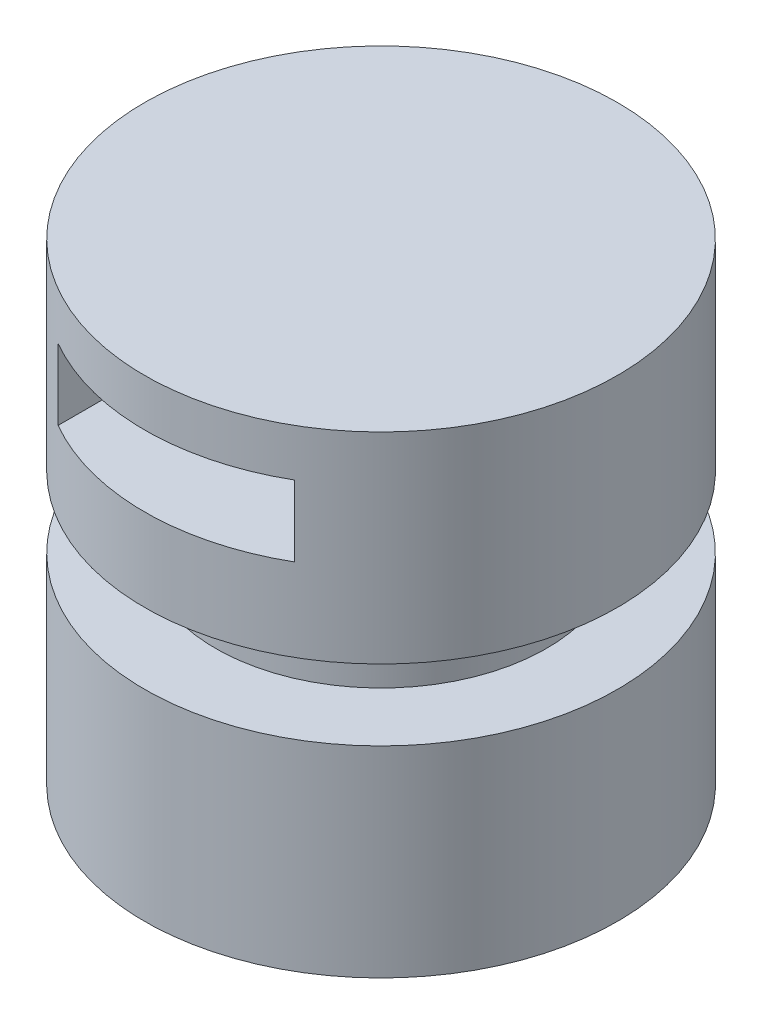
ISO-10303-21;
HEADER;
FILE_DESCRIPTION(('STEP AP214'),'2;1');
FILE_NAME('part.step','',(''),(''),'','','');
FILE_SCHEMA(('AUTOMOTIVE_DESIGN { 1 0 10303 214 1 1 1 1 }'));
ENDSEC;
DATA;
#1=APPLICATION_CONTEXT('core data for automotive mechanical design processes');
#2=APPLICATION_PROTOCOL_DEFINITION('international standard','automotive_design',2000,#1);
#3=PRODUCT_CONTEXT('',#1,'mechanical');
#4=PRODUCT('Part','Part','',(#3));
#5=PRODUCT_RELATED_PRODUCT_CATEGORY('part','',(#4));
#6=PRODUCT_DEFINITION_FORMATION('','',#4);
#7=PRODUCT_DEFINITION_CONTEXT('part definition',#1,'design');
#8=PRODUCT_DEFINITION('design','',#6,#7);
#9=PRODUCT_DEFINITION_SHAPE('','',#8);
#10=(LENGTH_UNIT() NAMED_UNIT(*) SI_UNIT(.MILLI.,.METRE.));
#11=(NAMED_UNIT(*) PLANE_ANGLE_UNIT() SI_UNIT($,.RADIAN.));
#12=(NAMED_UNIT(*) SI_UNIT($,.STERADIAN.) SOLID_ANGLE_UNIT());
#13=UNCERTAINTY_MEASURE_WITH_UNIT(LENGTH_MEASURE(1.E-05),#10,'distance_accuracy_value','');
#14=(GEOMETRIC_REPRESENTATION_CONTEXT(3) GLOBAL_UNCERTAINTY_ASSIGNED_CONTEXT((#13)) GLOBAL_UNIT_ASSIGNED_CONTEXT((#10,
#11,#12)) REPRESENTATION_CONTEXT('',''));
#15=CARTESIAN_POINT('',(0.,0.,0.));
#16=DIRECTION('',(0.,0.,1.));
#17=DIRECTION('',(1.,0.,0.));
#18=AXIS2_PLACEMENT_3D('',#15,#16,#17);
#19=CARTESIAN_POINT('',(0.,0.,0.));
#20=DIRECTION('',(0.,-1.,0.));
#21=DIRECTION('',(0.,0.,-1.));
#22=AXIS2_PLACEMENT_3D('',#19,#20,#21);
#23=CYLINDRICAL_SURFACE('',#22,100.);
#24=CARTESIAN_POINT('',(0.,85.,0.));
#25=DIRECTION('',(0.,-1.,0.));
#26=DIRECTION('',(0.,0.,-1.));
#27=AXIS2_PLACEMENT_3D('',#24,#25,#26);
#28=CIRCLE('',#27,100.);
#29=CARTESIAN_POINT('',(0.,85.,-100.));
#30=VERTEX_POINT('',#29);
#31=EDGE_CURVE('E110',#30,#30,#28,.T.);
#32=ORIENTED_EDGE('',*,*,#31,.T.);
#33=EDGE_LOOP('',(#32));
#34=FACE_BOUND('',#33,.T.);
#35=CARTESIAN_POINT('',(0.,0.,0.));
#36=DIRECTION('',(0.,-1.,0.));
#37=DIRECTION('',(0.,0.,-1.));
#38=AXIS2_PLACEMENT_3D('',#35,#36,#37);
#39=CIRCLE('',#38,100.);
#40=CARTESIAN_POINT('',(0.,0.,-100.));
#41=VERTEX_POINT('',#40);
#42=EDGE_CURVE('E113',#41,#41,#39,.T.);
#43=ORIENTED_EDGE('',*,*,#42,.F.);
#44=EDGE_LOOP('',(#43));
#45=FACE_BOUND('',#44,.T.);
#46=ADVANCED_FACE('F33',(#34,#45),#23,.T.);
#47=CARTESIAN_POINT('',(0.,0.,0.));
#48=DIRECTION('',(0.,-1.,0.));
#49=DIRECTION('',(0.,0.,-1.));
#50=AXIS2_PLACEMENT_3D('',#47,#48,#49);
#51=PLANE('',#50);
#52=ORIENTED_EDGE('',*,*,#42,.T.);
#53=EDGE_LOOP('',(#52));
#54=FACE_BOUND('',#53,.T.);
#55=ADVANCED_FACE('F136',(#54),#51,.T.);
#56=CARTESIAN_POINT('',(0.,85.,-100.));
#57=DIRECTION('',(0.,-1.,0.));
#58=DIRECTION('',(0.,0.,-1.));
#59=AXIS2_PLACEMENT_3D('',#56,#57,#58);
#60=PLANE('',#59);
#61=ORIENTED_EDGE('',*,*,#31,.F.);
#62=EDGE_LOOP('',(#61));
#63=FACE_BOUND('',#62,.T.);
#64=CARTESIAN_POINT('',(0.,85.,0.));
#65=DIRECTION('',(0.,-1.,0.));
#66=DIRECTION('',(0.,0.,-1.));
#67=AXIS2_PLACEMENT_3D('',#64,#65,#66);
#68=CIRCLE('',#67,70.);
#69=CARTESIAN_POINT('',(0.,85.,-70.));
#70=VERTEX_POINT('',#69);
#71=EDGE_CURVE('E107',#70,#70,#68,.T.);
#72=ORIENTED_EDGE('',*,*,#71,.T.);
#73=EDGE_LOOP('',(#72));
#74=FACE_BOUND('',#73,.T.);
#75=ADVANCED_FACE('F141',(#63,#74),#60,.F.);
#76=CARTESIAN_POINT('',(0.,-52.4217949634289,0.));
#77=DIRECTION('',(0.,-1.,0.));
#78=DIRECTION('',(0.,0.,-1.));
#79=AXIS2_PLACEMENT_3D('',#76,#77,#78);
#80=CYLINDRICAL_SURFACE('',#79,70.);
#81=ORIENTED_EDGE('',*,*,#71,.F.);
#82=EDGE_LOOP('',(#81));
#83=FACE_BOUND('',#82,.T.);
#84=CARTESIAN_POINT('',(0.,115.,0.));
#85=DIRECTION('',(0.,-1.,0.));
#86=DIRECTION('',(0.,0.,-1.));
#87=AXIS2_PLACEMENT_3D('',#84,#85,#86);
#88=CIRCLE('',#87,70.);
#89=CARTESIAN_POINT('',(0.,115.,-70.));
#90=VERTEX_POINT('',#89);
#91=EDGE_CURVE('E104',#90,#90,#88,.T.);
#92=ORIENTED_EDGE('',*,*,#91,.T.);
#93=EDGE_LOOP('',(#92));
#94=FACE_BOUND('',#93,.T.);
#95=ADVANCED_FACE('F149',(#83,#94),#80,.T.);
#96=CARTESIAN_POINT('',(0.,115.,-100.));
#97=DIRECTION('',(0.,1.,0.));
#98=DIRECTION('',(0.,0.,1.));
#99=AXIS2_PLACEMENT_3D('',#96,#97,#98);
#100=PLANE('',#99);
#101=ORIENTED_EDGE('',*,*,#91,.F.);
#102=EDGE_LOOP('',(#101));
#103=FACE_BOUND('',#102,.T.);
#104=CARTESIAN_POINT('',(0.,115.,0.));
#105=DIRECTION('',(0.,-1.,0.));
#106=DIRECTION('',(0.,0.,-1.));
#107=AXIS2_PLACEMENT_3D('',#104,#105,#106);
#108=CIRCLE('',#107,100.);
#109=CARTESIAN_POINT('',(0.,115.,-100.));
#110=VERTEX_POINT('',#109);
#111=EDGE_CURVE('E101',#110,#110,#108,.T.);
#112=ORIENTED_EDGE('',*,*,#111,.T.);
#113=EDGE_LOOP('',(#112));
#114=FACE_BOUND('',#113,.T.);
#115=ADVANCED_FACE('F132',(#103,#114),#100,.F.);
#116=CARTESIAN_POINT('',(0.,200.,0.));
#117=DIRECTION('',(0.,1.,0.));
#118=DIRECTION('',(0.,0.,1.));
#119=AXIS2_PLACEMENT_3D('',#116,#117,#118);
#120=PLANE('',#119);
#121=CARTESIAN_POINT('',(0.,200.,0.));
#122=DIRECTION('',(0.,-1.,0.));
#123=DIRECTION('',(0.,0.,-1.));
#124=AXIS2_PLACEMENT_3D('',#121,#122,#123);
#125=CIRCLE('',#124,100.);
#126=CARTESIAN_POINT('',(0.,200.,-100.));
#127=VERTEX_POINT('',#126);
#128=EDGE_CURVE('E116',#127,#127,#125,.T.);
#129=ORIENTED_EDGE('',*,*,#128,.F.);
#130=EDGE_LOOP('',(#129));
#131=FACE_BOUND('',#130,.T.);
#132=ADVANCED_FACE('F35',(#131),#120,.T.);
#133=CARTESIAN_POINT('',(0.,150.,0.));
#134=DIRECTION('',(0.,-1.,0.));
#135=DIRECTION('',(0.,0.,-1.));
#136=AXIS2_PLACEMENT_3D('',#133,#134,#135);
#137=CIRCLE('',#136,100.);
#138=CARTESIAN_POINT('',(-50.,150.,86.6025403784438));
#139=VERTEX_POINT('',#138);
#140=CARTESIAN_POINT('',(50.,150.,86.6025403784438));
#141=VERTEX_POINT('',#140);
#142=EDGE_CURVE('E56',#139,#141,#137,.F.);
#143=ORIENTED_EDGE('',*,*,#142,.F.);
#144=DIRECTION('',(0.,-1.,0.));
#145=VECTOR('',#144,1.);
#146=CARTESIAN_POINT('',(-50.,0.,86.6025403784438));
#147=LINE('',#146,#145);
#148=CARTESIAN_POINT('',(-50.,180.,86.6025403784438));
#149=VERTEX_POINT('',#148);
#150=EDGE_CURVE('E11',#149,#139,#147,.T.);
#151=ORIENTED_EDGE('',*,*,#150,.F.);
#152=CARTESIAN_POINT('',(0.,180.,0.));
#153=DIRECTION('',(0.,1.,0.));
#154=DIRECTION('',(0.,0.,1.));
#155=AXIS2_PLACEMENT_3D('',#152,#153,#154);
#156=CIRCLE('',#155,100.);
#157=CARTESIAN_POINT('',(50.,180.,86.6025403784438));
#158=VERTEX_POINT('',#157);
#159=EDGE_CURVE('E85',#158,#149,#156,.F.);
#160=ORIENTED_EDGE('',*,*,#159,.F.);
#161=DIRECTION('',(0.,-1.,0.));
#162=VECTOR('',#161,1.);
#163=CARTESIAN_POINT('',(50.,0.,86.6025403784438));
#164=LINE('',#163,#162);
#165=EDGE_CURVE('E83',#141,#158,#164,.F.);
#166=ORIENTED_EDGE('',*,*,#165,.F.);
#167=EDGE_LOOP('',(#143,#151,#160,#166));
#168=FACE_BOUND('',#167,.T.);
#169=DIRECTION('',(0.,-1.,0.));
#170=VECTOR('',#169,1.);
#171=CARTESIAN_POINT('',(-50.,0.,-86.6025403784438));
#172=LINE('',#171,#170);
#173=CARTESIAN_POINT('',(-50.,150.,-86.6025403784438));
#174=VERTEX_POINT('',#173);
#175=CARTESIAN_POINT('',(-50.,180.,-86.6025403784438));
#176=VERTEX_POINT('',#175);
#177=EDGE_CURVE('E41',#174,#176,#172,.F.);
#178=ORIENTED_EDGE('',*,*,#177,.F.);
#179=CARTESIAN_POINT('',(50.,150.,-86.6025403784438));
#180=VERTEX_POINT('',#179);
#181=EDGE_CURVE('E82',#180,#174,#137,.F.);
#182=ORIENTED_EDGE('',*,*,#181,.F.);
#183=DIRECTION('',(0.,-1.,0.));
#184=VECTOR('',#183,1.);
#185=CARTESIAN_POINT('',(50.,0.,-86.6025403784438));
#186=LINE('',#185,#184);
#187=CARTESIAN_POINT('',(50.,180.,-86.6025403784438));
#188=VERTEX_POINT('',#187);
#189=EDGE_CURVE('E80',#188,#180,#186,.T.);
#190=ORIENTED_EDGE('',*,*,#189,.F.);
#191=EDGE_CURVE('E75',#176,#188,#156,.F.);
#192=ORIENTED_EDGE('',*,*,#191,.F.);
#193=EDGE_LOOP('',(#178,#182,#190,#192));
#194=FACE_BOUND('',#193,.T.);
#195=ORIENTED_EDGE('',*,*,#111,.F.);
#196=EDGE_LOOP('',(#195));
#197=FACE_BOUND('',#196,.T.);
#198=ORIENTED_EDGE('',*,*,#128,.T.);
#199=EDGE_LOOP('',(#198));
#200=FACE_BOUND('',#199,.T.);
#201=ADVANCED_FACE('F77',(#168,#194,#197,#200),#23,.T.);
#202=CARTESIAN_POINT('',(50.,150.,-100.));
#203=DIRECTION('',(1.,0.,0.));
#204=DIRECTION('',(0.,0.,-1.));
#205=AXIS2_PLACEMENT_3D('',#202,#203,#204);
#206=PLANE('',#205);
#207=ORIENTED_EDGE('',*,*,#165,.T.);
#208=DIRECTION('',(0.,0.,1.));
#209=VECTOR('',#208,1.);
#210=CARTESIAN_POINT('',(50.,180.,-100.));
#211=LINE('',#210,#209);
#212=EDGE_CURVE('E48',#188,#158,#211,.T.);
#213=ORIENTED_EDGE('',*,*,#212,.F.);
#214=ORIENTED_EDGE('',*,*,#189,.T.);
#215=DIRECTION('',(0.,0.,1.));
#216=VECTOR('',#215,1.);
#217=CARTESIAN_POINT('',(50.,150.,-100.));
#218=LINE('',#217,#216);
#219=EDGE_CURVE('E96',#180,#141,#218,.T.);
#220=ORIENTED_EDGE('',*,*,#219,.T.);
#221=EDGE_LOOP('',(#207,#213,#214,#220));
#222=FACE_BOUND('',#221,.T.);
#223=ADVANCED_FACE('F124',(#222),#206,.F.);
#224=CARTESIAN_POINT('',(50.,150.,-100.));
#225=DIRECTION('',(0.,-1.,0.));
#226=DIRECTION('',(0.,0.,-1.));
#227=AXIS2_PLACEMENT_3D('',#224,#225,#226);
#228=PLANE('',#227);
#229=DIRECTION('',(0.,0.,1.));
#230=VECTOR('',#229,1.);
#231=CARTESIAN_POINT('',(-50.,150.,-100.));
#232=LINE('',#231,#230);
#233=EDGE_CURVE('E92',#174,#139,#232,.T.);
#234=ORIENTED_EDGE('',*,*,#233,.T.);
#235=ORIENTED_EDGE('',*,*,#142,.T.);
#236=ORIENTED_EDGE('',*,*,#219,.F.);
#237=ORIENTED_EDGE('',*,*,#181,.T.);
#238=EDGE_LOOP('',(#234,#235,#236,#237));
#239=FACE_BOUND('',#238,.T.);
#240=ADVANCED_FACE('F122',(#239),#228,.F.);
#241=CARTESIAN_POINT('',(-50.,150.,-100.));
#242=DIRECTION('',(-1.,0.,0.));
#243=DIRECTION('',(0.,0.,1.));
#244=AXIS2_PLACEMENT_3D('',#241,#242,#243);
#245=PLANE('',#244);
#246=ORIENTED_EDGE('',*,*,#177,.T.);
#247=DIRECTION('',(0.,0.,1.));
#248=VECTOR('',#247,1.);
#249=CARTESIAN_POINT('',(-50.,180.,-100.));
#250=LINE('',#249,#248);
#251=EDGE_CURVE('E90',#176,#149,#250,.T.);
#252=ORIENTED_EDGE('',*,*,#251,.T.);
#253=ORIENTED_EDGE('',*,*,#150,.T.);
#254=ORIENTED_EDGE('',*,*,#233,.F.);
#255=EDGE_LOOP('',(#246,#252,#253,#254));
#256=FACE_BOUND('',#255,.T.);
#257=ADVANCED_FACE('F89',(#256),#245,.F.);
#258=CARTESIAN_POINT('',(50.,180.,-100.));
#259=DIRECTION('',(0.,1.,0.));
#260=DIRECTION('',(0.,0.,1.));
#261=AXIS2_PLACEMENT_3D('',#258,#259,#260);
#262=PLANE('',#261);
#263=ORIENTED_EDGE('',*,*,#251,.F.);
#264=ORIENTED_EDGE('',*,*,#191,.T.);
#265=ORIENTED_EDGE('',*,*,#212,.T.);
#266=ORIENTED_EDGE('',*,*,#159,.T.);
#267=EDGE_LOOP('',(#263,#264,#265,#266));
#268=FACE_BOUND('',#267,.T.);
#269=ADVANCED_FACE('F93',(#268),#262,.F.);
#270=CLOSED_SHELL('',(#46,#55,#75,#95,#115,#132,#201,#223,#240,#257,#269));
#271=MANIFOLD_SOLID_BREP('B2',#270);
#272=ADVANCED_BREP_SHAPE_REPRESENTATION('',(#18,#271),#14);
#273=SHAPE_DEFINITION_REPRESENTATION(#9,#272);
ENDSEC;
END-ISO-10303-21;
